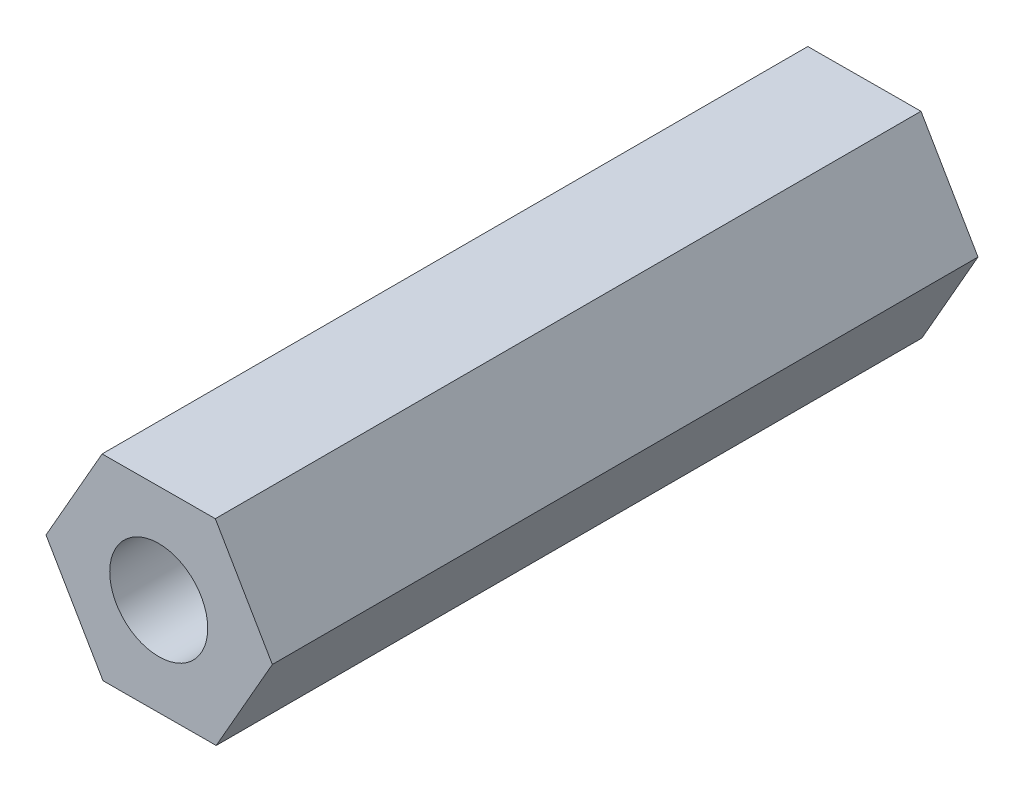
ISO-10303-21;
HEADER;
FILE_DESCRIPTION(('STEP AP214'),'2;1');
FILE_NAME('part.step','',(''),(''),'','','');
FILE_SCHEMA(('AUTOMOTIVE_DESIGN { 1 0 10303 214 1 1 1 1 }'));
ENDSEC;
DATA;
#1=APPLICATION_CONTEXT('core data for automotive mechanical design processes');
#2=APPLICATION_PROTOCOL_DEFINITION('international standard','automotive_design',2000,#1);
#3=PRODUCT_CONTEXT('',#1,'mechanical');
#4=PRODUCT('Part','Part','',(#3));
#5=PRODUCT_RELATED_PRODUCT_CATEGORY('part','',(#4));
#6=PRODUCT_DEFINITION_FORMATION('','',#4);
#7=PRODUCT_DEFINITION_CONTEXT('part definition',#1,'design');
#8=PRODUCT_DEFINITION('design','',#6,#7);
#9=PRODUCT_DEFINITION_SHAPE('','',#8);
#10=(LENGTH_UNIT() NAMED_UNIT(*) SI_UNIT(.MILLI.,.METRE.));
#11=(NAMED_UNIT(*) PLANE_ANGLE_UNIT() SI_UNIT($,.RADIAN.));
#12=(NAMED_UNIT(*) SI_UNIT($,.STERADIAN.) SOLID_ANGLE_UNIT());
#13=UNCERTAINTY_MEASURE_WITH_UNIT(LENGTH_MEASURE(1.E-05),#10,'distance_accuracy_value','');
#14=(GEOMETRIC_REPRESENTATION_CONTEXT(3) GLOBAL_UNCERTAINTY_ASSIGNED_CONTEXT((#13)) GLOBAL_UNIT_ASSIGNED_CONTEXT((#10,
#11,#12)) REPRESENTATION_CONTEXT('',''));
#15=CARTESIAN_POINT('',(0.,0.,0.));
#16=DIRECTION('',(0.,0.,1.));
#17=DIRECTION('',(1.,0.,0.));
#18=AXIS2_PLACEMENT_3D('',#15,#16,#17);
#19=CARTESIAN_POINT('',(-69.7440908169541,15.1559622259267,18.));
#20=DIRECTION('',(-0.00447565788556396,0.999989984193088,0.));
#21=DIRECTION('',(-0.999989984193088,-0.00447565788556396,0.));
#22=AXIS2_PLACEMENT_3D('',#19,#20,#21);
#23=PLANE('',#22);
#24=DIRECTION('',(0.999989984193087,0.00447565788556396,0.));
#25=VECTOR('',#24,1.);
#26=CARTESIAN_POINT('',(-69.7440908169541,15.1559622259267,0.));
#27=LINE('',#26,#25);
#28=CARTESIAN_POINT('',(-69.7440908169541,15.1559622259267,0.));
#29=VERTEX_POINT('',#28);
#30=CARTESIAN_POINT('',(-66.85736838415,15.1688823373519,0.));
#31=VERTEX_POINT('',#30);
#32=EDGE_CURVE('E121',#29,#31,#27,.T.);
#33=ORIENTED_EDGE('',*,*,#32,.T.);
#34=DIRECTION('',(0.,0.,-1.));
#35=VECTOR('',#34,1.);
#36=CARTESIAN_POINT('',(-66.85736838415,15.1688823373519,18.));
#37=LINE('',#36,#35);
#38=CARTESIAN_POINT('',(-66.85736838415,15.1688823373519,18.));
#39=VERTEX_POINT('',#38);
#40=EDGE_CURVE('E11',#39,#31,#37,.T.);
#41=ORIENTED_EDGE('',*,*,#40,.F.);
#42=DIRECTION('',(0.999989984193087,0.00447565788556396,0.));
#43=VECTOR('',#42,1.);
#44=CARTESIAN_POINT('',(-69.7440908169541,15.1559622259267,18.));
#45=LINE('',#44,#43);
#46=CARTESIAN_POINT('',(-69.7440908169541,15.1559622259267,18.));
#47=VERTEX_POINT('',#46);
#48=EDGE_CURVE('E132',#47,#39,#45,.T.);
#49=ORIENTED_EDGE('',*,*,#48,.F.);
#50=DIRECTION('',(0.,0.,-1.));
#51=VECTOR('',#50,1.);
#52=CARTESIAN_POINT('',(-69.7440908169541,15.1559622259267,18.));
#53=LINE('',#52,#51);
#54=EDGE_CURVE('E117',#47,#29,#53,.T.);
#55=ORIENTED_EDGE('',*,*,#54,.T.);
#56=EDGE_LOOP('',(#33,#41,#49,#55));
#57=FACE_BOUND('',#56,.T.);
#58=ADVANCED_FACE('F37',(#57),#23,.F.);
#59=CARTESIAN_POINT('',(-66.85736838415,15.1688823373519,18.));
#60=DIRECTION('',(-0.868254558783995,0.496118958668996,0.));
#61=DIRECTION('',(-0.496118958668996,-0.868254558783996,0.));
#62=AXIS2_PLACEMENT_3D('',#59,#60,#61);
#63=PLANE('',#62);
#64=DIRECTION('',(0.496118958668996,0.868254558783995,0.));
#65=VECTOR('',#64,1.);
#66=CARTESIAN_POINT('',(-66.85736838415,15.1688823373519,0.));
#67=LINE('',#66,#65);
#68=CARTESIAN_POINT('',(-65.4251963124619,17.6753173535472,0.));
#69=VERTEX_POINT('',#68);
#70=EDGE_CURVE('E124',#31,#69,#67,.T.);
#71=ORIENTED_EDGE('',*,*,#70,.T.);
#72=DIRECTION('',(0.,0.,-1.));
#73=VECTOR('',#72,1.);
#74=CARTESIAN_POINT('',(-65.4251963124619,17.6753173535472,18.));
#75=LINE('',#74,#73);
#76=CARTESIAN_POINT('',(-65.4251963124619,17.6753173535472,18.));
#77=VERTEX_POINT('',#76);
#78=EDGE_CURVE('E45',#77,#69,#75,.T.);
#79=ORIENTED_EDGE('',*,*,#78,.F.);
#80=DIRECTION('',(0.496118958668996,0.868254558783995,0.));
#81=VECTOR('',#80,1.);
#82=CARTESIAN_POINT('',(-66.85736838415,15.1688823373519,18.));
#83=LINE('',#82,#81);
#84=EDGE_CURVE('E90',#39,#77,#83,.T.);
#85=ORIENTED_EDGE('',*,*,#84,.F.);
#86=ORIENTED_EDGE('',*,*,#40,.T.);
#87=EDGE_LOOP('',(#71,#79,#85,#86));
#88=FACE_BOUND('',#87,.T.);
#89=ADVANCED_FACE('F157',(#88),#63,.F.);
#90=CARTESIAN_POINT('',(-65.4251963124619,17.6753173535472,18.));
#91=DIRECTION('',(-0.863778900898434,-0.503871025524086,0.));
#92=DIRECTION('',(0.503871025524086,-0.863778900898434,0.));
#93=AXIS2_PLACEMENT_3D('',#90,#91,#92);
#94=PLANE('',#93);
#95=DIRECTION('',(-0.503871025524086,0.863778900898434,0.));
#96=VECTOR('',#95,1.);
#97=CARTESIAN_POINT('',(-65.4251963124619,17.6753173535472,0.));
#98=LINE('',#97,#96);
#99=CARTESIAN_POINT('',(-66.8797466735779,20.1688322583173,0.));
#100=VERTEX_POINT('',#99);
#101=EDGE_CURVE('E127',#69,#100,#98,.T.);
#102=ORIENTED_EDGE('',*,*,#101,.T.);
#103=DIRECTION('',(0.,0.,-1.));
#104=VECTOR('',#103,1.);
#105=CARTESIAN_POINT('',(-66.8797466735779,20.1688322583173,18.));
#106=LINE('',#105,#104);
#107=CARTESIAN_POINT('',(-66.8797466735779,20.1688322583173,18.));
#108=VERTEX_POINT('',#107);
#109=EDGE_CURVE('E112',#108,#100,#106,.T.);
#110=ORIENTED_EDGE('',*,*,#109,.F.);
#111=DIRECTION('',(-0.503871025524086,0.863778900898434,0.));
#112=VECTOR('',#111,1.);
#113=CARTESIAN_POINT('',(-65.4251963124619,17.6753173535472,18.));
#114=LINE('',#113,#112);
#115=EDGE_CURVE('E103',#77,#108,#114,.T.);
#116=ORIENTED_EDGE('',*,*,#115,.F.);
#117=ORIENTED_EDGE('',*,*,#78,.T.);
#118=EDGE_LOOP('',(#102,#110,#116,#117));
#119=FACE_BOUND('',#118,.T.);
#120=ADVANCED_FACE('F138',(#119),#94,.F.);
#121=CARTESIAN_POINT('',(-66.8797466735779,20.1688322583173,18.));
#122=DIRECTION('',(0.00447565788556338,-0.999989984193087,0.));
#123=DIRECTION('',(0.999989984193087,0.00447565788556338,0.));
#124=AXIS2_PLACEMENT_3D('',#121,#122,#123);
#125=PLANE('',#124);
#126=DIRECTION('',(-0.999989984193087,-0.00447565788556338,0.));
#127=VECTOR('',#126,1.);
#128=CARTESIAN_POINT('',(-66.8797466735779,20.1688322583173,0.));
#129=LINE('',#128,#127);
#130=CARTESIAN_POINT('',(-69.7664691063819,20.1559121468922,0.));
#131=VERTEX_POINT('',#130);
#132=EDGE_CURVE('E111',#100,#131,#129,.T.);
#133=ORIENTED_EDGE('',*,*,#132,.T.);
#134=DIRECTION('',(0.,0.,-1.));
#135=VECTOR('',#134,1.);
#136=CARTESIAN_POINT('',(-69.7664691063819,20.1559121468922,18.));
#137=LINE('',#136,#135);
#138=CARTESIAN_POINT('',(-69.7664691063819,20.1559121468922,18.));
#139=VERTEX_POINT('',#138);
#140=EDGE_CURVE('E108',#139,#131,#137,.T.);
#141=ORIENTED_EDGE('',*,*,#140,.F.);
#142=DIRECTION('',(-0.999989984193087,-0.00447565788556338,0.));
#143=VECTOR('',#142,1.);
#144=CARTESIAN_POINT('',(-66.8797466735779,20.1688322583173,18.));
#145=LINE('',#144,#143);
#146=EDGE_CURVE('E97',#108,#139,#145,.T.);
#147=ORIENTED_EDGE('',*,*,#146,.F.);
#148=ORIENTED_EDGE('',*,*,#109,.T.);
#149=EDGE_LOOP('',(#133,#141,#147,#148));
#150=FACE_BOUND('',#149,.T.);
#151=ADVANCED_FACE('F109',(#150),#125,.F.);
#152=CARTESIAN_POINT('',(-69.7664691063819,20.1559121468922,18.));
#153=DIRECTION('',(0.868254558783993,-0.496118958669001,0.));
#154=DIRECTION('',(0.496118958669001,0.868254558783993,0.));
#155=AXIS2_PLACEMENT_3D('',#152,#153,#154);
#156=PLANE('',#155);
#157=DIRECTION('',(-0.496118958669001,-0.868254558783993,0.));
#158=VECTOR('',#157,1.);
#159=CARTESIAN_POINT('',(-69.7664691063819,20.1559121468922,0.));
#160=LINE('',#159,#158);
#161=CARTESIAN_POINT('',(-71.19864117807,17.6494771306969,0.));
#162=VERTEX_POINT('',#161);
#163=EDGE_CURVE('E76',#131,#162,#160,.T.);
#164=ORIENTED_EDGE('',*,*,#163,.T.);
#165=DIRECTION('',(0.,0.,-1.));
#166=VECTOR('',#165,1.);
#167=CARTESIAN_POINT('',(-71.19864117807,17.6494771306969,18.));
#168=LINE('',#167,#166);
#169=CARTESIAN_POINT('',(-71.19864117807,17.6494771306969,18.));
#170=VERTEX_POINT('',#169);
#171=EDGE_CURVE('E113',#170,#162,#168,.T.);
#172=ORIENTED_EDGE('',*,*,#171,.F.);
#173=DIRECTION('',(-0.496118958669001,-0.868254558783993,0.));
#174=VECTOR('',#173,1.);
#175=CARTESIAN_POINT('',(-69.7664691063819,20.1559121468922,18.));
#176=LINE('',#175,#174);
#177=EDGE_CURVE('E101',#139,#170,#176,.T.);
#178=ORIENTED_EDGE('',*,*,#177,.F.);
#179=ORIENTED_EDGE('',*,*,#140,.T.);
#180=EDGE_LOOP('',(#164,#172,#178,#179));
#181=FACE_BOUND('',#180,.T.);
#182=ADVANCED_FACE('F115',(#181),#156,.F.);
#183=CARTESIAN_POINT('',(-71.19864117807,17.6494771306969,18.));
#184=DIRECTION('',(0.86377890089843,0.503871025524092,0.));
#185=DIRECTION('',(-0.503871025524092,0.86377890089843,0.));
#186=AXIS2_PLACEMENT_3D('',#183,#184,#185);
#187=PLANE('',#186);
#188=DIRECTION('',(0.503871025524092,-0.86377890089843,0.));
#189=VECTOR('',#188,1.);
#190=CARTESIAN_POINT('',(-71.19864117807,17.6494771306969,0.));
#191=LINE('',#190,#189);
#192=EDGE_CURVE('E82',#162,#29,#191,.T.);
#193=ORIENTED_EDGE('',*,*,#192,.T.);
#194=ORIENTED_EDGE('',*,*,#54,.F.);
#195=DIRECTION('',(0.503871025524092,-0.86377890089843,0.));
#196=VECTOR('',#195,1.);
#197=CARTESIAN_POINT('',(-71.19864117807,17.6494771306969,18.));
#198=LINE('',#197,#196);
#199=EDGE_CURVE('E53',#170,#47,#198,.T.);
#200=ORIENTED_EDGE('',*,*,#199,.F.);
#201=ORIENTED_EDGE('',*,*,#171,.T.);
#202=EDGE_LOOP('',(#193,#194,#200,#201));
#203=FACE_BOUND('',#202,.T.);
#204=ADVANCED_FACE('F145',(#203),#187,.F.);
#205=CARTESIAN_POINT('',(0.,0.,18.));
#206=DIRECTION('',(0.,0.,1.));
#207=DIRECTION('',(1.,0.,0.));
#208=AXIS2_PLACEMENT_3D('',#205,#206,#207);
#209=PLANE('',#208);
#210=CARTESIAN_POINT('',(-68.3231078899799,17.6494771306969,18.));
#211=DIRECTION('',(0.,0.,1.));
#212=DIRECTION('',(1.,0.,0.));
#213=AXIS2_PLACEMENT_3D('',#210,#211,#212);
#214=CIRCLE('',#213,1.25);
#215=CARTESIAN_POINT('',(-67.0731078899799,17.6494771306969,18.));
#216=VERTEX_POINT('',#215);
#217=EDGE_CURVE('E125',#216,#216,#214,.T.);
#218=ORIENTED_EDGE('',*,*,#217,.F.);
#219=EDGE_LOOP('',(#218));
#220=FACE_BOUND('',#219,.T.);
#221=ORIENTED_EDGE('',*,*,#48,.T.);
#222=ORIENTED_EDGE('',*,*,#84,.T.);
#223=ORIENTED_EDGE('',*,*,#115,.T.);
#224=ORIENTED_EDGE('',*,*,#146,.T.);
#225=ORIENTED_EDGE('',*,*,#177,.T.);
#226=ORIENTED_EDGE('',*,*,#199,.T.);
#227=EDGE_LOOP('',(#221,#222,#223,#224,#225,#226));
#228=FACE_BOUND('',#227,.T.);
#229=ADVANCED_FACE('F99',(#220,#228),#209,.T.);
#230=CARTESIAN_POINT('',(0.,0.,0.));
#231=DIRECTION('',(0.,0.,1.));
#232=DIRECTION('',(1.,0.,0.));
#233=AXIS2_PLACEMENT_3D('',#230,#231,#232);
#234=PLANE('',#233);
#235=CARTESIAN_POINT('',(-68.3231078899799,17.6494771306969,0.));
#236=DIRECTION('',(0.,0.,-1.));
#237=DIRECTION('',(-1.,0.,0.));
#238=AXIS2_PLACEMENT_3D('',#235,#236,#237);
#239=CIRCLE('',#238,1.25);
#240=CARTESIAN_POINT('',(-69.5731078899799,17.6494771306969,0.));
#241=VERTEX_POINT('',#240);
#242=EDGE_CURVE('E244',#241,#241,#239,.T.);
#243=ORIENTED_EDGE('',*,*,#242,.F.);
#244=EDGE_LOOP('',(#243));
#245=FACE_BOUND('',#244,.T.);
#246=ORIENTED_EDGE('',*,*,#32,.F.);
#247=ORIENTED_EDGE('',*,*,#192,.F.);
#248=ORIENTED_EDGE('',*,*,#163,.F.);
#249=ORIENTED_EDGE('',*,*,#132,.F.);
#250=ORIENTED_EDGE('',*,*,#101,.F.);
#251=ORIENTED_EDGE('',*,*,#70,.F.);
#252=EDGE_LOOP('',(#246,#247,#248,#249,#250,#251));
#253=FACE_BOUND('',#252,.T.);
#254=ADVANCED_FACE('F141',(#245,#253),#234,.F.);
#255=CARTESIAN_POINT('',(-68.3231078899799,17.6494771306969,25.));
#256=DIRECTION('',(0.,0.,-1.));
#257=DIRECTION('',(-1.,0.,0.));
#258=AXIS2_PLACEMENT_3D('',#255,#256,#257);
#259=CYLINDRICAL_SURFACE('',#258,1.25);
#260=ORIENTED_EDGE('',*,*,#217,.T.);
#261=EDGE_LOOP('',(#260));
#262=FACE_BOUND('',#261,.T.);
#263=ORIENTED_EDGE('',*,*,#242,.T.);
#264=EDGE_LOOP('',(#263));
#265=FACE_BOUND('',#264,.T.);
#266=ADVANCED_FACE('F197',(#262,#265),#259,.F.);
#267=CLOSED_SHELL('',(#58,#89,#120,#151,#182,#204,#229,#254,#266));
#268=MANIFOLD_SOLID_BREP('B2',#267);
#269=ADVANCED_BREP_SHAPE_REPRESENTATION('',(#18,#268),#14);
#270=SHAPE_DEFINITION_REPRESENTATION(#9,#269);
ENDSEC;
END-ISO-10303-21;
